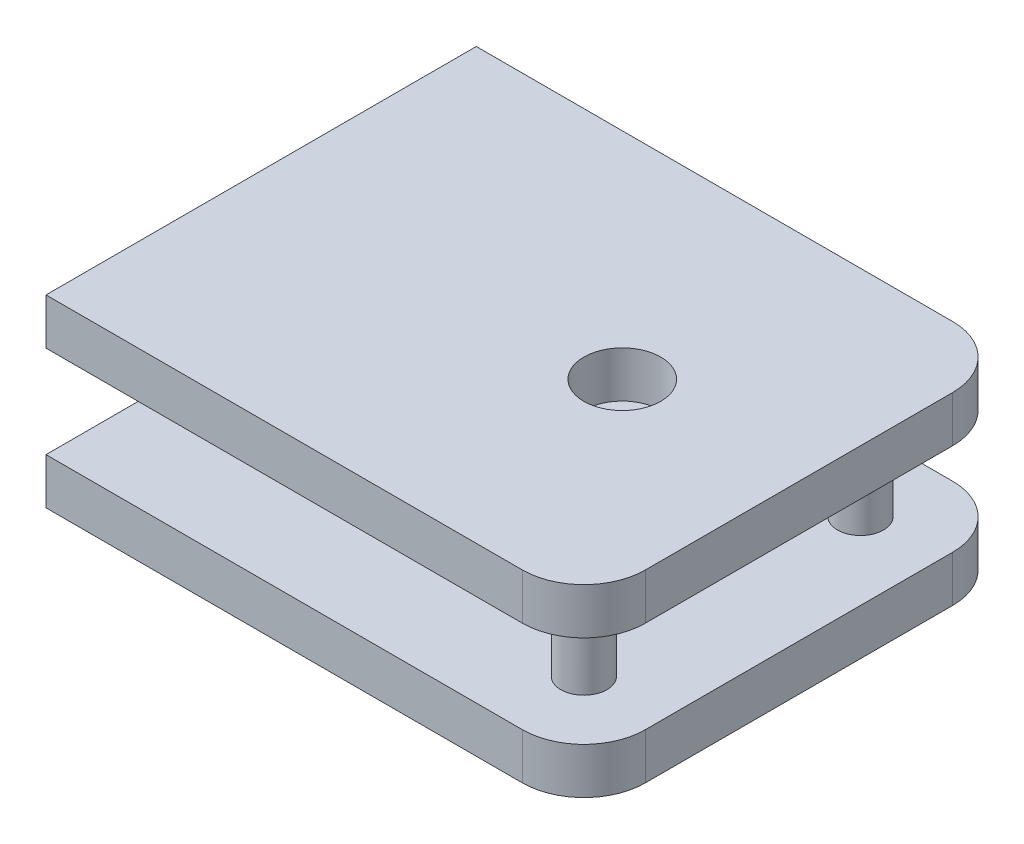
ISO-10303-21;
HEADER;
FILE_DESCRIPTION(('STEP AP214'),'2;1');
FILE_NAME('part.step','',(''),(''),'','','');
FILE_SCHEMA(('AUTOMOTIVE_DESIGN { 1 0 10303 214 1 1 1 1 }'));
ENDSEC;
DATA;
#1=APPLICATION_CONTEXT('core data for automotive mechanical design processes');
#2=APPLICATION_PROTOCOL_DEFINITION('international standard','automotive_design',2000,#1);
#3=PRODUCT_CONTEXT('',#1,'mechanical');
#4=PRODUCT('Part','Part','',(#3));
#5=PRODUCT_RELATED_PRODUCT_CATEGORY('part','',(#4));
#6=PRODUCT_DEFINITION_FORMATION('','',#4);
#7=PRODUCT_DEFINITION_CONTEXT('part definition',#1,'design');
#8=PRODUCT_DEFINITION('design','',#6,#7);
#9=PRODUCT_DEFINITION_SHAPE('','',#8);
#10=(LENGTH_UNIT() NAMED_UNIT(*) SI_UNIT(.MILLI.,.METRE.));
#11=(NAMED_UNIT(*) PLANE_ANGLE_UNIT() SI_UNIT($,.RADIAN.));
#12=(NAMED_UNIT(*) SI_UNIT($,.STERADIAN.) SOLID_ANGLE_UNIT());
#13=UNCERTAINTY_MEASURE_WITH_UNIT(LENGTH_MEASURE(1.E-05),#10,'distance_accuracy_value','');
#14=(GEOMETRIC_REPRESENTATION_CONTEXT(3) GLOBAL_UNCERTAINTY_ASSIGNED_CONTEXT((#13)) GLOBAL_UNIT_ASSIGNED_CONTEXT((#10,
#11,#12)) REPRESENTATION_CONTEXT('',''));
#15=CARTESIAN_POINT('',(0.,0.,0.));
#16=DIRECTION('',(0.,0.,1.));
#17=DIRECTION('',(1.,0.,0.));
#18=AXIS2_PLACEMENT_3D('',#15,#16,#17);
#19=CARTESIAN_POINT('',(-190.062896708017,172.405960568019,-2.3643929513454));
#20=DIRECTION('',(1.,0.,0.));
#21=DIRECTION('',(0.,0.,-1.));
#22=AXIS2_PLACEMENT_3D('',#19,#20,#21);
#23=PLANE('',#22);
#24=DIRECTION('',(0.,0.,-1.));
#25=VECTOR('',#24,1.);
#26=CARTESIAN_POINT('',(-190.062896708017,175.405960568019,-2.3643929513454));
#27=LINE('',#26,#25);
#28=CARTESIAN_POINT('',(-190.062896708017,175.405960568019,25.6356070486546));
#29=VERTEX_POINT('',#28);
#30=CARTESIAN_POINT('',(-190.062896708017,175.405960568019,-2.3643929513454));
#31=VERTEX_POINT('',#30);
#32=EDGE_CURVE('E123',#29,#31,#27,.T.);
#33=ORIENTED_EDGE('',*,*,#32,.T.);
#34=DIRECTION('',(0.,1.,0.));
#35=VECTOR('',#34,1.);
#36=CARTESIAN_POINT('',(-190.062896708017,172.405960568019,-2.3643929513454));
#37=LINE('',#36,#35);
#38=CARTESIAN_POINT('',(-190.062896708017,172.405960568019,-2.3643929513454));
#39=VERTEX_POINT('',#38);
#40=EDGE_CURVE('E141',#39,#31,#37,.T.);
#41=ORIENTED_EDGE('',*,*,#40,.F.);
#42=DIRECTION('',(0.,0.,-1.));
#43=VECTOR('',#42,1.);
#44=CARTESIAN_POINT('',(-190.062896708017,172.405960568019,-2.3643929513454));
#45=LINE('',#44,#43);
#46=CARTESIAN_POINT('',(-190.062896708017,172.405960568019,25.6356070486546));
#47=VERTEX_POINT('',#46);
#48=EDGE_CURVE('E134',#47,#39,#45,.T.);
#49=ORIENTED_EDGE('',*,*,#48,.F.);
#50=DIRECTION('',(0.,1.,0.));
#51=VECTOR('',#50,1.);
#52=CARTESIAN_POINT('',(-190.062896708017,172.405960568019,25.6356070486546));
#53=LINE('',#52,#51);
#54=EDGE_CURVE('E119',#47,#29,#53,.T.);
#55=ORIENTED_EDGE('',*,*,#54,.T.);
#56=EDGE_LOOP('',(#33,#41,#49,#55));
#57=FACE_BOUND('',#56,.T.);
#58=ADVANCED_FACE('F33',(#57),#23,.F.);
#59=CARTESIAN_POINT('',(-159.062896708017,172.405960568019,-2.3643929513454));
#60=DIRECTION('',(0.,0.,1.));
#61=DIRECTION('',(1.,0.,0.));
#62=AXIS2_PLACEMENT_3D('',#59,#60,#61);
#63=PLANE('',#62);
#64=DIRECTION('',(1.,0.,0.));
#65=VECTOR('',#64,1.);
#66=CARTESIAN_POINT('',(-159.062896708017,175.405960568019,-2.3643929513454));
#67=LINE('',#66,#65);
#68=CARTESIAN_POINT('',(-159.062896708017,175.405960568019,-2.3643929513454));
#69=VERTEX_POINT('',#68);
#70=EDGE_CURVE('E126',#31,#69,#67,.T.);
#71=ORIENTED_EDGE('',*,*,#70,.T.);
#72=DIRECTION('',(0.,1.,0.));
#73=VECTOR('',#72,1.);
#74=CARTESIAN_POINT('',(-159.062896708017,172.405960568019,-2.3643929513454));
#75=LINE('',#74,#73);
#76=CARTESIAN_POINT('',(-159.062896708017,172.405960568019,-2.3643929513454));
#77=VERTEX_POINT('',#76);
#78=EDGE_CURVE('E138',#77,#69,#75,.T.);
#79=ORIENTED_EDGE('',*,*,#78,.F.);
#80=DIRECTION('',(1.,0.,0.));
#81=VECTOR('',#80,1.);
#82=CARTESIAN_POINT('',(-159.062896708017,172.405960568019,-2.3643929513454));
#83=LINE('',#82,#81);
#84=EDGE_CURVE('E89',#39,#77,#83,.T.);
#85=ORIENTED_EDGE('',*,*,#84,.F.);
#86=ORIENTED_EDGE('',*,*,#40,.T.);
#87=EDGE_LOOP('',(#71,#79,#85,#86));
#88=FACE_BOUND('',#87,.T.);
#89=ADVANCED_FACE('F169',(#88),#63,.F.);
#90=CARTESIAN_POINT('',(-159.062896708017,172.405960568019,1.6356070486546));
#91=DIRECTION('',(0.,1.,0.));
#92=DIRECTION('',(0.,0.,1.));
#93=AXIS2_PLACEMENT_3D('',#90,#91,#92);
#94=CYLINDRICAL_SURFACE('',#93,4.);
#95=CARTESIAN_POINT('',(-159.062896708017,175.405960568019,1.6356070486546));
#96=DIRECTION('',(0.,-1.,0.));
#97=DIRECTION('',(0.,0.,-1.));
#98=AXIS2_PLACEMENT_3D('',#95,#96,#97);
#99=CIRCLE('',#98,4.);
#100=CARTESIAN_POINT('',(-155.062896708017,175.405960568019,1.63560704865463));
#101=VERTEX_POINT('',#100);
#102=EDGE_CURVE('E129',#69,#101,#99,.T.);
#103=ORIENTED_EDGE('',*,*,#102,.T.);
#104=DIRECTION('',(0.,1.,0.));
#105=VECTOR('',#104,1.);
#106=CARTESIAN_POINT('',(-155.062896708017,172.405960568019,1.63560704865463));
#107=LINE('',#106,#105);
#108=CARTESIAN_POINT('',(-155.062896708017,172.405960568019,1.63560704865463));
#109=VERTEX_POINT('',#108);
#110=EDGE_CURVE('E114',#109,#101,#107,.T.);
#111=ORIENTED_EDGE('',*,*,#110,.F.);
#112=CARTESIAN_POINT('',(-159.062896708017,172.405960568019,1.6356070486546));
#113=DIRECTION('',(0.,-1.,0.));
#114=DIRECTION('',(0.,0.,-1.));
#115=AXIS2_PLACEMENT_3D('',#112,#113,#114);
#116=CIRCLE('',#115,4.);
#117=EDGE_CURVE('E105',#77,#109,#116,.T.);
#118=ORIENTED_EDGE('',*,*,#117,.F.);
#119=ORIENTED_EDGE('',*,*,#78,.T.);
#120=EDGE_LOOP('',(#103,#111,#118,#119));
#121=FACE_BOUND('',#120,.T.);
#122=ADVANCED_FACE('F173',(#121),#94,.T.);
#123=CARTESIAN_POINT('',(-155.062896708017,172.405960568019,1.63560704865463));
#124=DIRECTION('',(-1.,0.,0.));
#125=DIRECTION('',(0.,0.,1.));
#126=AXIS2_PLACEMENT_3D('',#123,#124,#125);
#127=PLANE('',#126);
#128=DIRECTION('',(0.,0.,1.));
#129=VECTOR('',#128,1.);
#130=CARTESIAN_POINT('',(-155.062896708017,175.405960568019,1.63560704865463));
#131=LINE('',#130,#129);
#132=CARTESIAN_POINT('',(-155.062896708017,175.405960568019,21.6356070486546));
#133=VERTEX_POINT('',#132);
#134=EDGE_CURVE('E113',#101,#133,#131,.T.);
#135=ORIENTED_EDGE('',*,*,#134,.T.);
#136=DIRECTION('',(0.,1.,0.));
#137=VECTOR('',#136,1.);
#138=CARTESIAN_POINT('',(-155.062896708017,172.405960568019,21.6356070486546));
#139=LINE('',#138,#137);
#140=CARTESIAN_POINT('',(-155.062896708017,172.405960568019,21.6356070486546));
#141=VERTEX_POINT('',#140);
#142=EDGE_CURVE('E110',#141,#133,#139,.T.);
#143=ORIENTED_EDGE('',*,*,#142,.F.);
#144=DIRECTION('',(0.,0.,1.));
#145=VECTOR('',#144,1.);
#146=CARTESIAN_POINT('',(-155.062896708017,172.405960568019,1.63560704865463));
#147=LINE('',#146,#145);
#148=EDGE_CURVE('E99',#109,#141,#147,.T.);
#149=ORIENTED_EDGE('',*,*,#148,.F.);
#150=ORIENTED_EDGE('',*,*,#110,.T.);
#151=EDGE_LOOP('',(#135,#143,#149,#150));
#152=FACE_BOUND('',#151,.T.);
#153=ADVANCED_FACE('F111',(#152),#127,.F.);
#154=CARTESIAN_POINT('',(-159.062896708017,172.405960568019,21.6356070486546));
#155=DIRECTION('',(0.,1.,0.));
#156=DIRECTION('',(0.,0.,1.));
#157=AXIS2_PLACEMENT_3D('',#154,#155,#156);
#158=CYLINDRICAL_SURFACE('',#157,4.);
#159=CARTESIAN_POINT('',(-159.062896708017,175.405960568019,21.6356070486546));
#160=DIRECTION('',(0.,-1.,0.));
#161=DIRECTION('',(0.,0.,-1.));
#162=AXIS2_PLACEMENT_3D('',#159,#160,#161);
#163=CIRCLE('',#162,4.);
#164=CARTESIAN_POINT('',(-159.062896708017,175.405960568019,25.6356070486546));
#165=VERTEX_POINT('',#164);
#166=EDGE_CURVE('E74',#133,#165,#163,.T.);
#167=ORIENTED_EDGE('',*,*,#166,.T.);
#168=DIRECTION('',(0.,1.,0.));
#169=VECTOR('',#168,1.);
#170=CARTESIAN_POINT('',(-159.062896708017,172.405960568019,25.6356070486546));
#171=LINE('',#170,#169);
#172=CARTESIAN_POINT('',(-159.062896708017,172.405960568019,25.6356070486546));
#173=VERTEX_POINT('',#172);
#174=EDGE_CURVE('E115',#173,#165,#171,.T.);
#175=ORIENTED_EDGE('',*,*,#174,.F.);
#176=CARTESIAN_POINT('',(-159.062896708017,172.405960568019,21.6356070486546));
#177=DIRECTION('',(0.,-1.,0.));
#178=DIRECTION('',(0.,0.,-1.));
#179=AXIS2_PLACEMENT_3D('',#176,#177,#178);
#180=CIRCLE('',#179,4.);
#181=EDGE_CURVE('E103',#141,#173,#180,.T.);
#182=ORIENTED_EDGE('',*,*,#181,.F.);
#183=ORIENTED_EDGE('',*,*,#142,.T.);
#184=EDGE_LOOP('',(#167,#175,#182,#183));
#185=FACE_BOUND('',#184,.T.);
#186=ADVANCED_FACE('F117',(#185),#158,.T.);
#187=CARTESIAN_POINT('',(-159.062896708017,172.405960568019,25.6356070486546));
#188=DIRECTION('',(0.,0.,-1.));
#189=DIRECTION('',(-1.,0.,0.));
#190=AXIS2_PLACEMENT_3D('',#187,#188,#189);
#191=PLANE('',#190);
#192=DIRECTION('',(-1.,0.,0.));
#193=VECTOR('',#192,1.);
#194=CARTESIAN_POINT('',(-159.062896708017,175.405960568019,25.6356070486546));
#195=LINE('',#194,#193);
#196=EDGE_CURVE('E80',#165,#29,#195,.T.);
#197=ORIENTED_EDGE('',*,*,#196,.T.);
#198=ORIENTED_EDGE('',*,*,#54,.F.);
#199=DIRECTION('',(-1.,0.,0.));
#200=VECTOR('',#199,1.);
#201=CARTESIAN_POINT('',(-159.062896708017,172.405960568019,25.6356070486546));
#202=LINE('',#201,#200);
#203=EDGE_CURVE('E50',#173,#47,#202,.T.);
#204=ORIENTED_EDGE('',*,*,#203,.F.);
#205=ORIENTED_EDGE('',*,*,#174,.T.);
#206=EDGE_LOOP('',(#197,#198,#204,#205));
#207=FACE_BOUND('',#206,.T.);
#208=ADVANCED_FACE('F158',(#207),#191,.F.);
#209=CARTESIAN_POINT('',(-159.062896708017,172.405960568019,21.6356070486546));
#210=DIRECTION('',(0.,-1.,0.));
#211=DIRECTION('',(0.,0.,-1.));
#212=AXIS2_PLACEMENT_3D('',#209,#210,#211);
#213=PLANE('',#212);
#214=CARTESIAN_POINT('',(-166.562896708017,172.405960568019,11.6356070486546));
#215=DIRECTION('',(0.,-1.,0.));
#216=DIRECTION('',(0.,0.,-1.));
#217=AXIS2_PLACEMENT_3D('',#214,#215,#216);
#218=CIRCLE('',#217,2.5);
#219=CARTESIAN_POINT('',(-166.562896708017,172.405960568019,9.13560704865462));
#220=VERTEX_POINT('',#219);
#221=EDGE_CURVE('E330',#220,#220,#218,.F.);
#222=ORIENTED_EDGE('',*,*,#221,.T.);
#223=EDGE_LOOP('',(#222));
#224=FACE_BOUND('',#223,.T.);
#225=ORIENTED_EDGE('',*,*,#48,.T.);
#226=ORIENTED_EDGE('',*,*,#84,.T.);
#227=ORIENTED_EDGE('',*,*,#117,.T.);
#228=ORIENTED_EDGE('',*,*,#148,.T.);
#229=ORIENTED_EDGE('',*,*,#181,.T.);
#230=ORIENTED_EDGE('',*,*,#203,.T.);
#231=EDGE_LOOP('',(#225,#226,#227,#228,#229,#230));
#232=FACE_BOUND('',#231,.T.);
#233=ADVANCED_FACE('F101',(#224,#232),#213,.T.);
#234=CARTESIAN_POINT('',(-159.062896708017,175.405960568019,21.6356070486546));
#235=DIRECTION('',(0.,-1.,0.));
#236=DIRECTION('',(0.,0.,-1.));
#237=AXIS2_PLACEMENT_3D('',#234,#235,#236);
#238=PLANE('',#237);
#239=CARTESIAN_POINT('',(-166.562896708017,175.405960568019,11.6356070486546));
#240=DIRECTION('',(0.,-1.,0.));
#241=DIRECTION('',(0.,0.,-1.));
#242=AXIS2_PLACEMENT_3D('',#239,#240,#241);
#243=CIRCLE('',#242,2.5);
#244=CARTESIAN_POINT('',(-166.562896708017,175.405960568019,9.13560704865462));
#245=VERTEX_POINT('',#244);
#246=EDGE_CURVE('E333',#245,#245,#243,.T.);
#247=ORIENTED_EDGE('',*,*,#246,.T.);
#248=EDGE_LOOP('',(#247));
#249=FACE_BOUND('',#248,.T.);
#250=CARTESIAN_POINT('',(-160.062896708017,175.405960568019,20.6356070486546));
#251=DIRECTION('',(0.,-1.,0.));
#252=DIRECTION('',(0.,0.,-1.));
#253=AXIS2_PLACEMENT_3D('',#250,#251,#252);
#254=CIRCLE('',#253,1.5);
#255=CARTESIAN_POINT('',(-160.062896708017,175.405960568019,19.1356070486546));
#256=VERTEX_POINT('',#255);
#257=EDGE_CURVE('E11',#256,#256,#254,.F.);
#258=ORIENTED_EDGE('',*,*,#257,.F.);
#259=EDGE_LOOP('',(#258));
#260=FACE_BOUND('',#259,.T.);
#261=CARTESIAN_POINT('',(-160.062896708017,175.405960568019,2.6356070486546));
#262=DIRECTION('',(0.,-1.,0.));
#263=DIRECTION('',(0.,0.,-1.));
#264=AXIS2_PLACEMENT_3D('',#261,#262,#263);
#265=CIRCLE('',#264,1.5);
#266=CARTESIAN_POINT('',(-160.062896708017,175.405960568019,1.13560704865461));
#267=VERTEX_POINT('',#266);
#268=EDGE_CURVE('E42',#267,#267,#265,.F.);
#269=ORIENTED_EDGE('',*,*,#268,.F.);
#270=EDGE_LOOP('',(#269));
#271=FACE_BOUND('',#270,.T.);
#272=ORIENTED_EDGE('',*,*,#32,.F.);
#273=ORIENTED_EDGE('',*,*,#196,.F.);
#274=ORIENTED_EDGE('',*,*,#166,.F.);
#275=ORIENTED_EDGE('',*,*,#134,.F.);
#276=ORIENTED_EDGE('',*,*,#102,.F.);
#277=ORIENTED_EDGE('',*,*,#70,.F.);
#278=EDGE_LOOP('',(#272,#273,#274,#275,#276,#277));
#279=FACE_BOUND('',#278,.T.);
#280=ADVANCED_FACE('F148',(#249,#260,#271,#279),#238,.F.);
#281=CARTESIAN_POINT('',(-160.062896708017,181.405960568019,2.6356070486546));
#282=DIRECTION('',(0.,-1.,0.));
#283=DIRECTION('',(0.,0.,-1.));
#284=AXIS2_PLACEMENT_3D('',#281,#282,#283);
#285=CYLINDRICAL_SURFACE('',#284,1.5);
#286=CARTESIAN_POINT('',(-160.062896708017,181.405960568019,2.6356070486546));
#287=DIRECTION('',(0.,1.,0.));
#288=DIRECTION('',(0.,0.,1.));
#289=AXIS2_PLACEMENT_3D('',#286,#287,#288);
#290=CIRCLE('',#289,1.5);
#291=CARTESIAN_POINT('',(-160.062896708017,181.405960568019,4.1356070486546));
#292=VERTEX_POINT('',#291);
#293=EDGE_CURVE('E127',#292,#292,#290,.T.);
#294=ORIENTED_EDGE('',*,*,#293,.F.);
#295=EDGE_LOOP('',(#294));
#296=FACE_BOUND('',#295,.T.);
#297=ORIENTED_EDGE('',*,*,#268,.T.);
#298=EDGE_LOOP('',(#297));
#299=FACE_BOUND('',#298,.T.);
#300=ADVANCED_FACE('F146',(#296,#299),#285,.T.);
#301=CARTESIAN_POINT('',(-160.062896708017,181.405960568019,20.6356070486546));
#302=DIRECTION('',(0.,-1.,0.));
#303=DIRECTION('',(0.,0.,-1.));
#304=AXIS2_PLACEMENT_3D('',#301,#302,#303);
#305=CYLINDRICAL_SURFACE('',#304,1.5);
#306=CARTESIAN_POINT('',(-160.062896708017,181.405960568019,20.6356070486546));
#307=DIRECTION('',(0.,1.,0.));
#308=DIRECTION('',(0.,0.,1.));
#309=AXIS2_PLACEMENT_3D('',#306,#307,#308);
#310=CIRCLE('',#309,1.5);
#311=CARTESIAN_POINT('',(-160.062896708017,181.405960568019,22.1356070486546));
#312=VERTEX_POINT('',#311);
#313=EDGE_CURVE('E393',#312,#312,#310,.T.);
#314=ORIENTED_EDGE('',*,*,#313,.F.);
#315=EDGE_LOOP('',(#314));
#316=FACE_BOUND('',#315,.T.);
#317=ORIENTED_EDGE('',*,*,#257,.T.);
#318=EDGE_LOOP('',(#317));
#319=FACE_BOUND('',#318,.T.);
#320=ADVANCED_FACE('F203',(#316,#319),#305,.T.);
#321=CARTESIAN_POINT('',(-159.062896708017,184.405960568019,-2.3643929513454));
#322=DIRECTION('',(0.,0.,1.));
#323=DIRECTION('',(1.,0.,0.));
#324=AXIS2_PLACEMENT_3D('',#321,#322,#323);
#325=PLANE('',#324);
#326=DIRECTION('',(-1.,0.,0.));
#327=VECTOR('',#326,1.);
#328=CARTESIAN_POINT('',(-159.062896708017,181.405960568019,-2.3643929513454));
#329=LINE('',#328,#327);
#330=CARTESIAN_POINT('',(-159.062896708017,181.405960568019,-2.3643929513454));
#331=VERTEX_POINT('',#330);
#332=CARTESIAN_POINT('',(-190.062896708017,181.405960568019,-2.3643929513454));
#333=VERTEX_POINT('',#332);
#334=EDGE_CURVE('E334',#331,#333,#329,.T.);
#335=ORIENTED_EDGE('',*,*,#334,.T.);
#336=DIRECTION('',(0.,-1.,0.));
#337=VECTOR('',#336,1.);
#338=CARTESIAN_POINT('',(-190.062896708017,184.405960568019,-2.3643929513454));
#339=LINE('',#338,#337);
#340=CARTESIAN_POINT('',(-190.062896708017,184.405960568019,-2.3643929513454));
#341=VERTEX_POINT('',#340);
#342=EDGE_CURVE('E390',#341,#333,#339,.T.);
#343=ORIENTED_EDGE('',*,*,#342,.F.);
#344=DIRECTION('',(-1.,0.,0.));
#345=VECTOR('',#344,1.);
#346=CARTESIAN_POINT('',(-159.062896708017,184.405960568019,-2.3643929513454));
#347=LINE('',#346,#345);
#348=CARTESIAN_POINT('',(-159.062896708017,184.405960568019,-2.3643929513454));
#349=VERTEX_POINT('',#348);
#350=EDGE_CURVE('E343',#349,#341,#347,.T.);
#351=ORIENTED_EDGE('',*,*,#350,.F.);
#352=DIRECTION('',(0.,-1.,0.));
#353=VECTOR('',#352,1.);
#354=CARTESIAN_POINT('',(-159.062896708017,184.405960568019,-2.3643929513454));
#355=LINE('',#354,#353);
#356=EDGE_CURVE('E361',#349,#331,#355,.T.);
#357=ORIENTED_EDGE('',*,*,#356,.T.);
#358=EDGE_LOOP('',(#335,#343,#351,#357));
#359=FACE_BOUND('',#358,.T.);
#360=ADVANCED_FACE('F214',(#359),#325,.F.);
#361=CARTESIAN_POINT('',(-190.062896708017,184.405960568019,-2.3643929513454));
#362=DIRECTION('',(1.,0.,0.));
#363=DIRECTION('',(0.,0.,-1.));
#364=AXIS2_PLACEMENT_3D('',#361,#362,#363);
#365=PLANE('',#364);
#366=DIRECTION('',(0.,0.,1.));
#367=VECTOR('',#366,1.);
#368=CARTESIAN_POINT('',(-190.062896708017,181.405960568019,-2.3643929513454));
#369=LINE('',#368,#367);
#370=CARTESIAN_POINT('',(-190.062896708017,181.405960568019,25.6356070486546));
#371=VERTEX_POINT('',#370);
#372=EDGE_CURVE('E337',#333,#371,#369,.T.);
#373=ORIENTED_EDGE('',*,*,#372,.T.);
#374=DIRECTION('',(0.,-1.,0.));
#375=VECTOR('',#374,1.);
#376=CARTESIAN_POINT('',(-190.062896708017,184.405960568019,25.6356070486546));
#377=LINE('',#376,#375);
#378=CARTESIAN_POINT('',(-190.062896708017,184.405960568019,25.6356070486546));
#379=VERTEX_POINT('',#378);
#380=EDGE_CURVE('E387',#379,#371,#377,.T.);
#381=ORIENTED_EDGE('',*,*,#380,.F.);
#382=DIRECTION('',(0.,0.,1.));
#383=VECTOR('',#382,1.);
#384=CARTESIAN_POINT('',(-190.062896708017,184.405960568019,-2.3643929513454));
#385=LINE('',#384,#383);
#386=EDGE_CURVE('E346',#341,#379,#385,.T.);
#387=ORIENTED_EDGE('',*,*,#386,.F.);
#388=ORIENTED_EDGE('',*,*,#342,.T.);
#389=EDGE_LOOP('',(#373,#381,#387,#388));
#390=FACE_BOUND('',#389,.T.);
#391=ADVANCED_FACE('F224',(#390),#365,.F.);
#392=CARTESIAN_POINT('',(-190.062896708017,184.405960568019,25.6356070486546));
#393=DIRECTION('',(0.,0.,-1.));
#394=DIRECTION('',(-1.,0.,0.));
#395=AXIS2_PLACEMENT_3D('',#392,#393,#394);
#396=PLANE('',#395);
#397=DIRECTION('',(1.,0.,0.));
#398=VECTOR('',#397,1.);
#399=CARTESIAN_POINT('',(-190.062896708017,181.405960568019,25.6356070486546));
#400=LINE('',#399,#398);
#401=CARTESIAN_POINT('',(-159.062896708017,181.405960568019,25.6356070486546));
#402=VERTEX_POINT('',#401);
#403=EDGE_CURVE('E365',#371,#402,#400,.T.);
#404=ORIENTED_EDGE('',*,*,#403,.T.);
#405=DIRECTION('',(0.,-1.,0.));
#406=VECTOR('',#405,1.);
#407=CARTESIAN_POINT('',(-159.062896708017,184.405960568019,25.6356070486546));
#408=LINE('',#407,#406);
#409=CARTESIAN_POINT('',(-159.062896708017,184.405960568019,25.6356070486546));
#410=VERTEX_POINT('',#409);
#411=EDGE_CURVE('E384',#410,#402,#408,.T.);
#412=ORIENTED_EDGE('',*,*,#411,.F.);
#413=DIRECTION('',(1.,0.,0.));
#414=VECTOR('',#413,1.);
#415=CARTESIAN_POINT('',(-190.062896708017,184.405960568019,25.6356070486546));
#416=LINE('',#415,#414);
#417=EDGE_CURVE('E350',#379,#410,#416,.T.);
#418=ORIENTED_EDGE('',*,*,#417,.F.);
#419=ORIENTED_EDGE('',*,*,#380,.T.);
#420=EDGE_LOOP('',(#404,#412,#418,#419));
#421=FACE_BOUND('',#420,.T.);
#422=ADVANCED_FACE('F234',(#421),#396,.F.);
#423=CARTESIAN_POINT('',(-159.062896708017,184.405960568019,21.6356070486546));
#424=DIRECTION('',(0.,-1.,0.));
#425=DIRECTION('',(0.,0.,-1.));
#426=AXIS2_PLACEMENT_3D('',#423,#424,#425);
#427=CYLINDRICAL_SURFACE('',#426,4.);
#428=CARTESIAN_POINT('',(-159.062896708017,181.405960568019,21.6356070486546));
#429=DIRECTION('',(0.,1.,0.));
#430=DIRECTION('',(0.,0.,1.));
#431=AXIS2_PLACEMENT_3D('',#428,#429,#430);
#432=CIRCLE('',#431,4.);
#433=CARTESIAN_POINT('',(-155.062896708017,181.405960568019,21.6356070486546));
#434=VERTEX_POINT('',#433);
#435=EDGE_CURVE('E368',#402,#434,#432,.T.);
#436=ORIENTED_EDGE('',*,*,#435,.T.);
#437=DIRECTION('',(0.,-1.,0.));
#438=VECTOR('',#437,1.);
#439=CARTESIAN_POINT('',(-155.062896708017,184.405960568019,21.6356070486546));
#440=LINE('',#439,#438);
#441=CARTESIAN_POINT('',(-155.062896708017,184.405960568019,21.6356070486546));
#442=VERTEX_POINT('',#441);
#443=EDGE_CURVE('E381',#442,#434,#440,.T.);
#444=ORIENTED_EDGE('',*,*,#443,.F.);
#445=CARTESIAN_POINT('',(-159.062896708017,184.405960568019,21.6356070486546));
#446=DIRECTION('',(0.,1.,0.));
#447=DIRECTION('',(0.,0.,1.));
#448=AXIS2_PLACEMENT_3D('',#445,#446,#447);
#449=CIRCLE('',#448,4.);
#450=EDGE_CURVE('E353',#410,#442,#449,.T.);
#451=ORIENTED_EDGE('',*,*,#450,.F.);
#452=ORIENTED_EDGE('',*,*,#411,.T.);
#453=EDGE_LOOP('',(#436,#444,#451,#452));
#454=FACE_BOUND('',#453,.T.);
#455=ADVANCED_FACE('F244',(#454),#427,.T.);
#456=CARTESIAN_POINT('',(-155.062896708017,184.405960568019,21.6356070486546));
#457=DIRECTION('',(-1.,0.,0.));
#458=DIRECTION('',(0.,0.,1.));
#459=AXIS2_PLACEMENT_3D('',#456,#457,#458);
#460=PLANE('',#459);
#461=DIRECTION('',(0.,0.,-1.));
#462=VECTOR('',#461,1.);
#463=CARTESIAN_POINT('',(-155.062896708017,181.405960568019,21.6356070486546));
#464=LINE('',#463,#462);
#465=CARTESIAN_POINT('',(-155.062896708017,181.405960568019,1.63560704865463));
#466=VERTEX_POINT('',#465);
#467=EDGE_CURVE('E371',#434,#466,#464,.T.);
#468=ORIENTED_EDGE('',*,*,#467,.T.);
#469=DIRECTION('',(0.,-1.,0.));
#470=VECTOR('',#469,1.);
#471=CARTESIAN_POINT('',(-155.062896708017,184.405960568019,1.63560704865463));
#472=LINE('',#471,#470);
#473=CARTESIAN_POINT('',(-155.062896708017,184.405960568019,1.63560704865463));
#474=VERTEX_POINT('',#473);
#475=EDGE_CURVE('E378',#474,#466,#472,.T.);
#476=ORIENTED_EDGE('',*,*,#475,.F.);
#477=DIRECTION('',(0.,0.,-1.));
#478=VECTOR('',#477,1.);
#479=CARTESIAN_POINT('',(-155.062896708017,184.405960568019,21.6356070486546));
#480=LINE('',#479,#478);
#481=EDGE_CURVE('E356',#442,#474,#480,.T.);
#482=ORIENTED_EDGE('',*,*,#481,.F.);
#483=ORIENTED_EDGE('',*,*,#443,.T.);
#484=EDGE_LOOP('',(#468,#476,#482,#483));
#485=FACE_BOUND('',#484,.T.);
#486=ADVANCED_FACE('F254',(#485),#460,.F.);
#487=CARTESIAN_POINT('',(-159.062896708017,184.405960568019,1.6356070486546));
#488=DIRECTION('',(0.,-1.,0.));
#489=DIRECTION('',(0.,0.,-1.));
#490=AXIS2_PLACEMENT_3D('',#487,#488,#489);
#491=CYLINDRICAL_SURFACE('',#490,4.);
#492=CARTESIAN_POINT('',(-159.062896708017,181.405960568019,1.6356070486546));
#493=DIRECTION('',(0.,1.,0.));
#494=DIRECTION('',(0.,0.,1.));
#495=AXIS2_PLACEMENT_3D('',#492,#493,#494);
#496=CIRCLE('',#495,4.);
#497=EDGE_CURVE('E347',#466,#331,#496,.T.);
#498=ORIENTED_EDGE('',*,*,#497,.T.);
#499=ORIENTED_EDGE('',*,*,#356,.F.);
#500=CARTESIAN_POINT('',(-159.062896708017,184.405960568019,1.6356070486546));
#501=DIRECTION('',(0.,1.,0.));
#502=DIRECTION('',(0.,0.,1.));
#503=AXIS2_PLACEMENT_3D('',#500,#501,#502);
#504=CIRCLE('',#503,4.);
#505=EDGE_CURVE('E359',#474,#349,#504,.T.);
#506=ORIENTED_EDGE('',*,*,#505,.F.);
#507=ORIENTED_EDGE('',*,*,#475,.T.);
#508=EDGE_LOOP('',(#498,#499,#506,#507));
#509=FACE_BOUND('',#508,.T.);
#510=ADVANCED_FACE('F264',(#509),#491,.T.);
#511=CARTESIAN_POINT('',(-159.062896708017,184.405960568019,21.6356070486546));
#512=DIRECTION('',(0.,1.,0.));
#513=DIRECTION('',(0.,0.,1.));
#514=AXIS2_PLACEMENT_3D('',#511,#512,#513);
#515=PLANE('',#514);
#516=CARTESIAN_POINT('',(-166.562896708017,184.405960568019,11.6356070486546));
#517=DIRECTION('',(0.,1.,0.));
#518=DIRECTION('',(0.,0.,1.));
#519=AXIS2_PLACEMENT_3D('',#516,#517,#518);
#520=CIRCLE('',#519,2.5);
#521=CARTESIAN_POINT('',(-166.562896708017,184.405960568019,14.1356070486546));
#522=VERTEX_POINT('',#521);
#523=EDGE_CURVE('E446',#522,#522,#520,.T.);
#524=ORIENTED_EDGE('',*,*,#523,.F.);
#525=EDGE_LOOP('',(#524));
#526=FACE_BOUND('',#525,.T.);
#527=ORIENTED_EDGE('',*,*,#350,.T.);
#528=ORIENTED_EDGE('',*,*,#386,.T.);
#529=ORIENTED_EDGE('',*,*,#417,.T.);
#530=ORIENTED_EDGE('',*,*,#450,.T.);
#531=ORIENTED_EDGE('',*,*,#481,.T.);
#532=ORIENTED_EDGE('',*,*,#505,.T.);
#533=EDGE_LOOP('',(#527,#528,#529,#530,#531,#532));
#534=FACE_BOUND('',#533,.T.);
#535=ADVANCED_FACE('F274',(#526,#534),#515,.T.);
#536=CARTESIAN_POINT('',(-159.062896708017,181.405960568019,21.6356070486546));
#537=DIRECTION('',(0.,1.,0.));
#538=DIRECTION('',(0.,0.,1.));
#539=AXIS2_PLACEMENT_3D('',#536,#537,#538);
#540=PLANE('',#539);
#541=CARTESIAN_POINT('',(-166.562896708017,181.405960568019,11.6356070486546));
#542=DIRECTION('',(0.,1.,0.));
#543=DIRECTION('',(0.,0.,1.));
#544=AXIS2_PLACEMENT_3D('',#541,#542,#543);
#545=CIRCLE('',#544,2.5);
#546=CARTESIAN_POINT('',(-166.562896708017,181.405960568019,14.1356070486546));
#547=VERTEX_POINT('',#546);
#548=EDGE_CURVE('E36',#547,#547,#545,.T.);
#549=ORIENTED_EDGE('',*,*,#548,.T.);
#550=EDGE_LOOP('',(#549));
#551=FACE_BOUND('',#550,.T.);
#552=ORIENTED_EDGE('',*,*,#293,.T.);
#553=EDGE_LOOP('',(#552));
#554=FACE_BOUND('',#553,.T.);
#555=ORIENTED_EDGE('',*,*,#313,.T.);
#556=EDGE_LOOP('',(#555));
#557=FACE_BOUND('',#556,.T.);
#558=ORIENTED_EDGE('',*,*,#334,.F.);
#559=ORIENTED_EDGE('',*,*,#497,.F.);
#560=ORIENTED_EDGE('',*,*,#467,.F.);
#561=ORIENTED_EDGE('',*,*,#435,.F.);
#562=ORIENTED_EDGE('',*,*,#403,.F.);
#563=ORIENTED_EDGE('',*,*,#372,.F.);
#564=EDGE_LOOP('',(#558,#559,#560,#561,#562,#563));
#565=FACE_BOUND('',#564,.T.);
#566=ADVANCED_FACE('F294',(#551,#554,#557,#565),#540,.F.);
#567=CARTESIAN_POINT('',(-166.562896708017,165.334892756154,11.6356070486546));
#568=DIRECTION('',(0.,1.,0.));
#569=DIRECTION('',(0.,0.,1.));
#570=AXIS2_PLACEMENT_3D('',#567,#568,#569);
#571=CYLINDRICAL_SURFACE('',#570,2.5);
#572=ORIENTED_EDGE('',*,*,#523,.T.);
#573=EDGE_LOOP('',(#572));
#574=FACE_BOUND('',#573,.T.);
#575=ORIENTED_EDGE('',*,*,#548,.F.);
#576=EDGE_LOOP('',(#575));
#577=FACE_BOUND('',#576,.T.);
#578=ADVANCED_FACE('F304',(#574,#577),#571,.F.);
#579=ORIENTED_EDGE('',*,*,#221,.F.);
#580=EDGE_LOOP('',(#579));
#581=FACE_BOUND('',#580,.T.);
#582=ORIENTED_EDGE('',*,*,#246,.F.);
#583=EDGE_LOOP('',(#582));
#584=FACE_BOUND('',#583,.T.);
#585=ADVANCED_FACE('F314',(#581,#584),#571,.F.);
#586=CLOSED_SHELL('',(#58,#89,#122,#153,#186,#208,#233,#280,#300,#320,#360,#391,#422,#455,#486,
#510,#535,#566,#578,#585));
#587=MANIFOLD_SOLID_BREP('B2',#586);
#588=ADVANCED_BREP_SHAPE_REPRESENTATION('',(#18,#587),#14);
#589=SHAPE_DEFINITION_REPRESENTATION(#9,#588);
ENDSEC;
END-ISO-10303-21;
